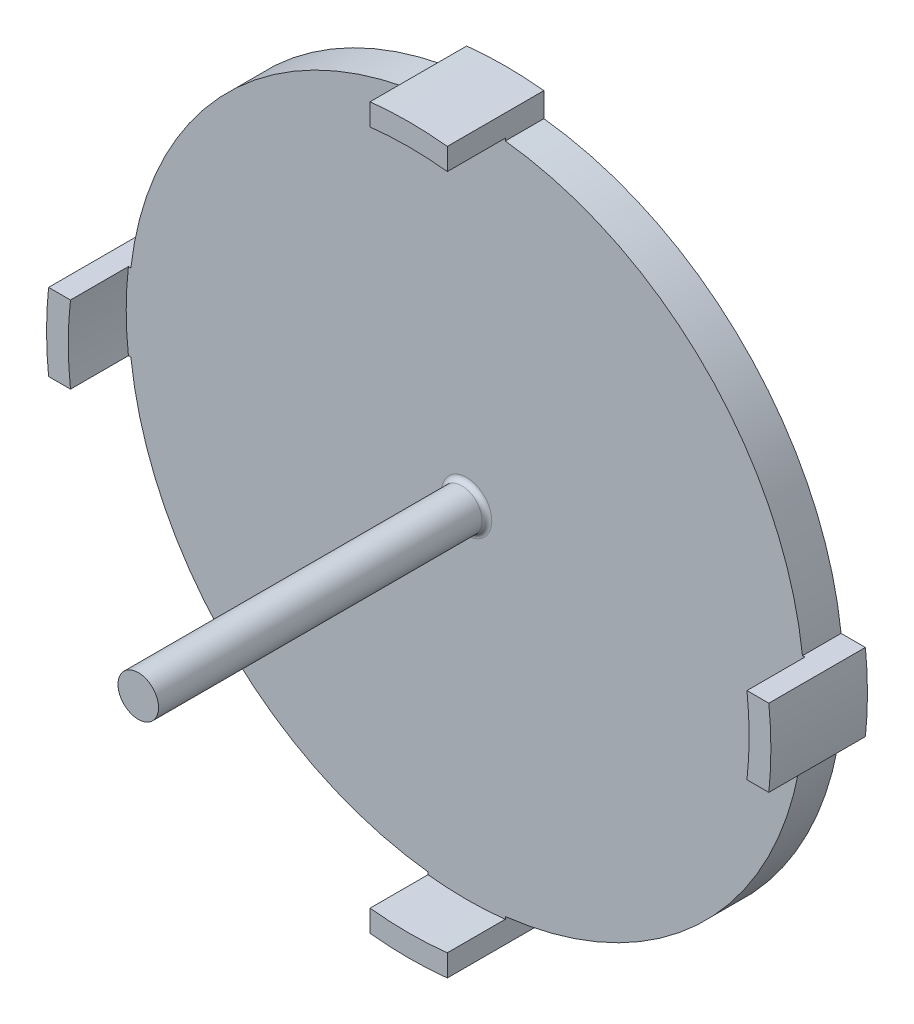
ISO-10303-21;
HEADER;
FILE_DESCRIPTION(('STEP AP214'),'2;1');
FILE_NAME('part.step','',(''),(''),'','','');
FILE_SCHEMA(('AUTOMOTIVE_DESIGN { 1 0 10303 214 1 1 1 1 }'));
ENDSEC;
DATA;
#1=APPLICATION_CONTEXT('core data for automotive mechanical design processes');
#2=APPLICATION_PROTOCOL_DEFINITION('international standard','automotive_design',2000,#1);
#3=PRODUCT_CONTEXT('',#1,'mechanical');
#4=PRODUCT('Part','Part','',(#3));
#5=PRODUCT_RELATED_PRODUCT_CATEGORY('part','',(#4));
#6=PRODUCT_DEFINITION_FORMATION('','',#4);
#7=PRODUCT_DEFINITION_CONTEXT('part definition',#1,'design');
#8=PRODUCT_DEFINITION('design','',#6,#7);
#9=PRODUCT_DEFINITION_SHAPE('','',#8);
#10=(LENGTH_UNIT() NAMED_UNIT(*) SI_UNIT(.MILLI.,.METRE.));
#11=(NAMED_UNIT(*) PLANE_ANGLE_UNIT() SI_UNIT($,.RADIAN.));
#12=(NAMED_UNIT(*) SI_UNIT($,.STERADIAN.) SOLID_ANGLE_UNIT());
#13=UNCERTAINTY_MEASURE_WITH_UNIT(LENGTH_MEASURE(1.E-05),#10,'distance_accuracy_value','');
#14=(GEOMETRIC_REPRESENTATION_CONTEXT(3) GLOBAL_UNCERTAINTY_ASSIGNED_CONTEXT((#13)) GLOBAL_UNIT_ASSIGNED_CONTEXT((#10,
#11,#12)) REPRESENTATION_CONTEXT('',''));
#15=CARTESIAN_POINT('',(0.,0.,0.));
#16=DIRECTION('',(0.,0.,1.));
#17=DIRECTION('',(1.,0.,0.));
#18=AXIS2_PLACEMENT_3D('',#15,#16,#17);
#19=CARTESIAN_POINT('',(0.,0.,10.));
#20=DIRECTION('',(0.,0.,-1.));
#21=DIRECTION('',(-1.,0.,0.));
#22=AXIS2_PLACEMENT_3D('',#19,#20,#21);
#23=CYLINDRICAL_SURFACE('',#22,35.25);
#24=CARTESIAN_POINT('',(0.,0.,4.));
#25=DIRECTION('',(0.,0.,1.));
#26=DIRECTION('',(1.,0.,0.));
#27=AXIS2_PLACEMENT_3D('',#24,#25,#26);
#28=CIRCLE('',#27,35.25);
#29=CARTESIAN_POINT('',(-35.0223143153047,4.00000000000012,4.));
#30=VERTEX_POINT('',#29);
#31=CARTESIAN_POINT('',(-35.0223143153048,-3.99999999999961,4.));
#32=VERTEX_POINT('',#31);
#33=EDGE_CURVE('E57',#30,#32,#28,.T.);
#34=ORIENTED_EDGE('',*,*,#33,.F.);
#35=DIRECTION('',(0.,0.,-1.));
#36=VECTOR('',#35,1.);
#37=CARTESIAN_POINT('',(-35.0223143153047,4.00000000000012,10.));
#38=LINE('',#37,#36);
#39=CARTESIAN_POINT('',(-35.0223143153047,4.00000000000012,10.));
#40=VERTEX_POINT('',#39);
#41=EDGE_CURVE('E85',#40,#30,#38,.T.);
#42=ORIENTED_EDGE('',*,*,#41,.F.);
#43=CARTESIAN_POINT('',(0.,0.,10.));
#44=DIRECTION('',(0.,0.,1.));
#45=DIRECTION('',(1.,0.,0.));
#46=AXIS2_PLACEMENT_3D('',#43,#44,#45);
#47=CIRCLE('',#46,35.25);
#48=CARTESIAN_POINT('',(-35.0223143153048,-3.99999999999961,10.));
#49=VERTEX_POINT('',#48);
#50=EDGE_CURVE('E373',#40,#49,#47,.T.);
#51=ORIENTED_EDGE('',*,*,#50,.T.);
#52=DIRECTION('',(0.,0.,-1.));
#53=VECTOR('',#52,1.);
#54=CARTESIAN_POINT('',(-35.0223143153048,-3.99999999999961,10.));
#55=LINE('',#54,#53);
#56=EDGE_CURVE('E381',#49,#32,#55,.T.);
#57=ORIENTED_EDGE('',*,*,#56,.T.);
#58=EDGE_LOOP('',(#34,#42,#51,#57));
#59=FACE_BOUND('',#58,.T.);
#60=ADVANCED_FACE('F41',(#59),#23,.F.);
#61=CARTESIAN_POINT('',(0.,4.,10.));
#62=DIRECTION('',(0.,-1.,0.));
#63=DIRECTION('',(1.,0.,0.));
#64=AXIS2_PLACEMENT_3D('',#61,#62,#63);
#65=PLANE('',#64);
#66=DIRECTION('',(-1.,0.,0.));
#67=VECTOR('',#66,1.);
#68=CARTESIAN_POINT('',(0.,4.,0.));
#69=LINE('',#68,#67);
#70=CARTESIAN_POINT('',(-34.7706773014274,4.00000000000012,0.));
#71=VERTEX_POINT('',#70);
#72=CARTESIAN_POINT('',(-37.2860563750043,4.00000000000013,0.));
#73=VERTEX_POINT('',#72);
#74=EDGE_CURVE('E375',#71,#73,#69,.T.);
#75=ORIENTED_EDGE('',*,*,#74,.T.);
#76=DIRECTION('',(0.,0.,-1.));
#77=VECTOR('',#76,1.);
#78=CARTESIAN_POINT('',(-37.2860563750043,4.00000000000013,10.));
#79=LINE('',#78,#77);
#80=CARTESIAN_POINT('',(-37.2860563750043,4.00000000000013,10.));
#81=VERTEX_POINT('',#80);
#82=EDGE_CURVE('E389',#81,#73,#79,.T.);
#83=ORIENTED_EDGE('',*,*,#82,.F.);
#84=DIRECTION('',(-1.,0.,0.));
#85=VECTOR('',#84,1.);
#86=CARTESIAN_POINT('',(0.,4.,10.));
#87=LINE('',#86,#85);
#88=EDGE_CURVE('E374',#40,#81,#87,.T.);
#89=ORIENTED_EDGE('',*,*,#88,.F.);
#90=ORIENTED_EDGE('',*,*,#41,.T.);
#91=DIRECTION('',(-1.,0.,0.));
#92=VECTOR('',#91,1.);
#93=CARTESIAN_POINT('',(0.,4.,4.));
#94=LINE('',#93,#92);
#95=CARTESIAN_POINT('',(-34.7706773014274,4.00000000000012,4.));
#96=VERTEX_POINT('',#95);
#97=EDGE_CURVE('E315',#96,#30,#94,.T.);
#98=ORIENTED_EDGE('',*,*,#97,.F.);
#99=DIRECTION('',(0.,0.,-1.));
#100=VECTOR('',#99,1.);
#101=CARTESIAN_POINT('',(-34.7706773014274,4.00000000000012,4.));
#102=LINE('',#101,#100);
#103=EDGE_CURVE('E365',#96,#71,#102,.T.);
#104=ORIENTED_EDGE('',*,*,#103,.T.);
#105=EDGE_LOOP('',(#75,#83,#89,#90,#98,#104));
#106=FACE_BOUND('',#105,.T.);
#107=ADVANCED_FACE('F406',(#106),#65,.F.);
#108=CARTESIAN_POINT('',(0.,0.,10.));
#109=DIRECTION('',(0.,0.,-1.));
#110=DIRECTION('',(-1.,0.,0.));
#111=AXIS2_PLACEMENT_3D('',#108,#109,#110);
#112=CYLINDRICAL_SURFACE('',#111,37.5);
#113=CARTESIAN_POINT('',(0.,0.,0.));
#114=DIRECTION('',(0.,0.,1.));
#115=DIRECTION('',(1.,0.,0.));
#116=AXIS2_PLACEMENT_3D('',#113,#114,#115);
#117=CIRCLE('',#116,37.5);
#118=CARTESIAN_POINT('',(-37.2860563750044,-3.99999999999961,0.));
#119=VERTEX_POINT('',#118);
#120=EDGE_CURVE('E81',#73,#119,#117,.T.);
#121=ORIENTED_EDGE('',*,*,#120,.T.);
#122=DIRECTION('',(0.,0.,-1.));
#123=VECTOR('',#122,1.);
#124=CARTESIAN_POINT('',(-37.2860563750044,-3.99999999999961,10.));
#125=LINE('',#124,#123);
#126=CARTESIAN_POINT('',(-37.2860563750044,-3.99999999999961,10.));
#127=VERTEX_POINT('',#126);
#128=EDGE_CURVE('E387',#127,#119,#125,.T.);
#129=ORIENTED_EDGE('',*,*,#128,.F.);
#130=CARTESIAN_POINT('',(0.,0.,10.));
#131=DIRECTION('',(0.,0.,1.));
#132=DIRECTION('',(1.,0.,0.));
#133=AXIS2_PLACEMENT_3D('',#130,#131,#132);
#134=CIRCLE('',#133,37.5);
#135=EDGE_CURVE('E378',#81,#127,#134,.T.);
#136=ORIENTED_EDGE('',*,*,#135,.F.);
#137=ORIENTED_EDGE('',*,*,#82,.T.);
#138=EDGE_LOOP('',(#121,#129,#136,#137));
#139=FACE_BOUND('',#138,.T.);
#140=ADVANCED_FACE('F412',(#139),#112,.T.);
#141=CARTESIAN_POINT('',(0.,-3.99999999999959,10.));
#142=DIRECTION('',(0.,1.,0.));
#143=DIRECTION('',(-1.,0.,0.));
#144=AXIS2_PLACEMENT_3D('',#141,#142,#143);
#145=PLANE('',#144);
#146=DIRECTION('',(1.,0.,0.));
#147=VECTOR('',#146,1.);
#148=CARTESIAN_POINT('',(0.,-3.99999999999959,0.));
#149=LINE('',#148,#147);
#150=CARTESIAN_POINT('',(-34.7706773014275,-3.99999999999961,0.));
#151=VERTEX_POINT('',#150);
#152=EDGE_CURVE('E376',#119,#151,#149,.T.);
#153=ORIENTED_EDGE('',*,*,#152,.T.);
#154=DIRECTION('',(0.,0.,-1.));
#155=VECTOR('',#154,1.);
#156=CARTESIAN_POINT('',(-34.7706773014275,-3.99999999999961,4.));
#157=LINE('',#156,#155);
#158=CARTESIAN_POINT('',(-34.7706773014275,-3.99999999999961,4.));
#159=VERTEX_POINT('',#158);
#160=EDGE_CURVE('E363',#159,#151,#157,.T.);
#161=ORIENTED_EDGE('',*,*,#160,.F.);
#162=DIRECTION('',(1.,0.,0.));
#163=VECTOR('',#162,1.);
#164=CARTESIAN_POINT('',(0.,-3.99999999999959,4.));
#165=LINE('',#164,#163);
#166=EDGE_CURVE('E316',#32,#159,#165,.T.);
#167=ORIENTED_EDGE('',*,*,#166,.F.);
#168=ORIENTED_EDGE('',*,*,#56,.F.);
#169=DIRECTION('',(1.,0.,0.));
#170=VECTOR('',#169,1.);
#171=CARTESIAN_POINT('',(0.,-3.99999999999959,10.));
#172=LINE('',#171,#170);
#173=EDGE_CURVE('E62',#127,#49,#172,.T.);
#174=ORIENTED_EDGE('',*,*,#173,.F.);
#175=ORIENTED_EDGE('',*,*,#128,.T.);
#176=EDGE_LOOP('',(#153,#161,#167,#168,#174,#175));
#177=FACE_BOUND('',#176,.T.);
#178=ADVANCED_FACE('F416',(#177),#145,.F.);
#179=CARTESIAN_POINT('',(0.,0.,10.));
#180=DIRECTION('',(0.,0.,1.));
#181=DIRECTION('',(1.,0.,0.));
#182=AXIS2_PLACEMENT_3D('',#179,#180,#181);
#183=PLANE('',#182);
#184=ORIENTED_EDGE('',*,*,#50,.F.);
#185=ORIENTED_EDGE('',*,*,#88,.T.);
#186=ORIENTED_EDGE('',*,*,#135,.T.);
#187=ORIENTED_EDGE('',*,*,#173,.T.);
#188=EDGE_LOOP('',(#184,#185,#186,#187));
#189=FACE_BOUND('',#188,.T.);
#190=ADVANCED_FACE('F423',(#189),#183,.T.);
#191=CARTESIAN_POINT('',(0.,0.,0.));
#192=DIRECTION('',(0.,0.,1.));
#193=DIRECTION('',(1.,0.,0.));
#194=AXIS2_PLACEMENT_3D('',#191,#192,#193);
#195=PLANE('',#194);
#196=ORIENTED_EDGE('',*,*,#74,.F.);
#197=CARTESIAN_POINT('',(0.,0.,0.));
#198=DIRECTION('',(0.,0.,1.));
#199=DIRECTION('',(1.,0.,0.));
#200=AXIS2_PLACEMENT_3D('',#197,#198,#199);
#201=CIRCLE('',#200,35.);
#202=CARTESIAN_POINT('',(-4.,34.7706773014274,0.));
#203=VERTEX_POINT('',#202);
#204=EDGE_CURVE('E336',#203,#71,#201,.T.);
#205=ORIENTED_EDGE('',*,*,#204,.F.);
#206=DIRECTION('',(0.,-1.,0.));
#207=VECTOR('',#206,1.);
#208=CARTESIAN_POINT('',(-4.,0.,0.));
#209=LINE('',#208,#207);
#210=CARTESIAN_POINT('',(-4.,37.2860563750043,0.));
#211=VERTEX_POINT('',#210);
#212=EDGE_CURVE('E337',#211,#203,#209,.T.);
#213=ORIENTED_EDGE('',*,*,#212,.F.);
#214=CARTESIAN_POINT('',(0.,0.,0.));
#215=DIRECTION('',(0.,0.,1.));
#216=DIRECTION('',(1.,0.,0.));
#217=AXIS2_PLACEMENT_3D('',#214,#215,#216);
#218=CIRCLE('',#217,37.5);
#219=CARTESIAN_POINT('',(4.,37.2860563750043,0.));
#220=VERTEX_POINT('',#219);
#221=EDGE_CURVE('E273',#220,#211,#218,.T.);
#222=ORIENTED_EDGE('',*,*,#221,.F.);
#223=DIRECTION('',(0.,-1.,0.));
#224=VECTOR('',#223,1.);
#225=CARTESIAN_POINT('',(4.,0.,0.));
#226=LINE('',#225,#224);
#227=CARTESIAN_POINT('',(4.,34.7706773014274,0.));
#228=VERTEX_POINT('',#227);
#229=EDGE_CURVE('E333',#220,#228,#226,.T.);
#230=ORIENTED_EDGE('',*,*,#229,.T.);
#231=CARTESIAN_POINT('',(34.7706773014274,3.99999999999988,0.));
#232=VERTEX_POINT('',#231);
#233=EDGE_CURVE('E300',#232,#228,#201,.T.);
#234=ORIENTED_EDGE('',*,*,#233,.F.);
#235=DIRECTION('',(-1.,0.,0.));
#236=VECTOR('',#235,1.);
#237=CARTESIAN_POINT('',(0.,4.,0.));
#238=LINE('',#237,#236);
#239=CARTESIAN_POINT('',(37.2860563750043,3.99999999999987,0.));
#240=VERTEX_POINT('',#239);
#241=EDGE_CURVE('E302',#240,#232,#238,.T.);
#242=ORIENTED_EDGE('',*,*,#241,.F.);
#243=CARTESIAN_POINT('',(0.,0.,0.));
#244=DIRECTION('',(0.,0.,1.));
#245=DIRECTION('',(1.,0.,0.));
#246=AXIS2_PLACEMENT_3D('',#243,#244,#245);
#247=CIRCLE('',#246,37.5);
#248=CARTESIAN_POINT('',(37.2860563750044,-3.99999999999958,0.));
#249=VERTEX_POINT('',#248);
#250=EDGE_CURVE('E225',#249,#240,#247,.T.);
#251=ORIENTED_EDGE('',*,*,#250,.F.);
#252=DIRECTION('',(1.,0.,0.));
#253=VECTOR('',#252,1.);
#254=CARTESIAN_POINT('',(0.,-3.99999999999983,0.));
#255=LINE('',#254,#253);
#256=CARTESIAN_POINT('',(34.7706773014275,-3.99999999999959,0.));
#257=VERTEX_POINT('',#256);
#258=EDGE_CURVE('E350',#257,#249,#255,.T.);
#259=ORIENTED_EDGE('',*,*,#258,.F.);
#260=CARTESIAN_POINT('',(4.,-34.7706773014274,0.));
#261=VERTEX_POINT('',#260);
#262=EDGE_CURVE('E339',#261,#257,#201,.T.);
#263=ORIENTED_EDGE('',*,*,#262,.F.);
#264=DIRECTION('',(0.,1.,0.));
#265=VECTOR('',#264,1.);
#266=CARTESIAN_POINT('',(3.99999999999998,0.,0.));
#267=LINE('',#266,#265);
#268=CARTESIAN_POINT('',(4.,-37.2860563750043,0.));
#269=VERTEX_POINT('',#268);
#270=EDGE_CURVE('E343',#269,#261,#267,.T.);
#271=ORIENTED_EDGE('',*,*,#270,.F.);
#272=CARTESIAN_POINT('',(0.,0.,0.));
#273=DIRECTION('',(0.,0.,1.));
#274=DIRECTION('',(1.,0.,0.));
#275=AXIS2_PLACEMENT_3D('',#272,#273,#274);
#276=CIRCLE('',#275,37.5);
#277=CARTESIAN_POINT('',(-4.,-37.2860563750043,0.));
#278=VERTEX_POINT('',#277);
#279=EDGE_CURVE('E240',#278,#269,#276,.T.);
#280=ORIENTED_EDGE('',*,*,#279,.F.);
#281=DIRECTION('',(0.,-1.,0.));
#282=VECTOR('',#281,1.);
#283=CARTESIAN_POINT('',(-4.,0.,0.));
#284=LINE('',#283,#282);
#285=CARTESIAN_POINT('',(-4.,-34.7706773014274,0.));
#286=VERTEX_POINT('',#285);
#287=EDGE_CURVE('E342',#286,#278,#284,.T.);
#288=ORIENTED_EDGE('',*,*,#287,.F.);
#289=EDGE_CURVE('E345',#151,#286,#201,.T.);
#290=ORIENTED_EDGE('',*,*,#289,.F.);
#291=ORIENTED_EDGE('',*,*,#152,.F.);
#292=ORIENTED_EDGE('',*,*,#120,.F.);
#293=EDGE_LOOP('',(#196,#205,#213,#222,#230,#234,#242,#251,#259,#263,#271,#280,#288,#290,#291,#292));
#294=FACE_BOUND('',#293,.T.);
#295=ADVANCED_FACE('F421',(#294),#195,.F.);
#296=CARTESIAN_POINT('',(0.,0.,4.));
#297=DIRECTION('',(0.,0.,-1.));
#298=DIRECTION('',(-1.,0.,0.));
#299=AXIS2_PLACEMENT_3D('',#296,#297,#298);
#300=CYLINDRICAL_SURFACE('',#299,35.);
#301=ORIENTED_EDGE('',*,*,#233,.T.);
#302=DIRECTION('',(0.,0.,-1.));
#303=VECTOR('',#302,1.);
#304=CARTESIAN_POINT('',(4.,34.7706773014274,4.));
#305=LINE('',#304,#303);
#306=CARTESIAN_POINT('',(4.,34.7706773014274,4.));
#307=VERTEX_POINT('',#306);
#308=EDGE_CURVE('E367',#307,#228,#305,.T.);
#309=ORIENTED_EDGE('',*,*,#308,.F.);
#310=CARTESIAN_POINT('',(0.,0.,4.));
#311=DIRECTION('',(0.,0.,1.));
#312=DIRECTION('',(1.,0.,0.));
#313=AXIS2_PLACEMENT_3D('',#310,#311,#312);
#314=CIRCLE('',#313,35.);
#315=CARTESIAN_POINT('',(34.7706773014274,3.99999999999988,4.));
#316=VERTEX_POINT('',#315);
#317=EDGE_CURVE('E298',#316,#307,#314,.T.);
#318=ORIENTED_EDGE('',*,*,#317,.F.);
#319=DIRECTION('',(0.,0.,-1.));
#320=VECTOR('',#319,1.);
#321=CARTESIAN_POINT('',(34.7706773014274,3.99999999999988,4.));
#322=LINE('',#321,#320);
#323=EDGE_CURVE('E335',#316,#232,#322,.T.);
#324=ORIENTED_EDGE('',*,*,#323,.T.);
#325=EDGE_LOOP('',(#301,#309,#318,#324));
#326=FACE_BOUND('',#325,.T.);
#327=ADVANCED_FACE('F426',(#326),#300,.T.);
#328=CARTESIAN_POINT('',(4.,0.,4.));
#329=DIRECTION('',(1.,0.,0.));
#330=DIRECTION('',(0.,0.,-1.));
#331=AXIS2_PLACEMENT_3D('',#328,#329,#330);
#332=PLANE('',#331);
#333=ORIENTED_EDGE('',*,*,#229,.F.);
#334=DIRECTION('',(0.,0.,-1.));
#335=VECTOR('',#334,1.);
#336=CARTESIAN_POINT('',(4.,37.2860563750043,10.));
#337=LINE('',#336,#335);
#338=CARTESIAN_POINT('',(4.,37.2860563750043,10.));
#339=VERTEX_POINT('',#338);
#340=EDGE_CURVE('E293',#339,#220,#337,.T.);
#341=ORIENTED_EDGE('',*,*,#340,.F.);
#342=DIRECTION('',(0.,-1.,0.));
#343=VECTOR('',#342,1.);
#344=CARTESIAN_POINT('',(4.,0.,10.));
#345=LINE('',#344,#343);
#346=CARTESIAN_POINT('',(4.,35.0223143153048,10.));
#347=VERTEX_POINT('',#346);
#348=EDGE_CURVE('E274',#339,#347,#345,.T.);
#349=ORIENTED_EDGE('',*,*,#348,.T.);
#350=DIRECTION('',(0.,0.,-1.));
#351=VECTOR('',#350,1.);
#352=CARTESIAN_POINT('',(4.,35.0223143153048,10.));
#353=LINE('',#352,#351);
#354=CARTESIAN_POINT('',(4.,35.0223143153048,4.));
#355=VERTEX_POINT('',#354);
#356=EDGE_CURVE('E282',#347,#355,#353,.T.);
#357=ORIENTED_EDGE('',*,*,#356,.T.);
#358=DIRECTION('',(0.,-1.,0.));
#359=VECTOR('',#358,1.);
#360=CARTESIAN_POINT('',(4.,0.,4.));
#361=LINE('',#360,#359);
#362=EDGE_CURVE('E301',#355,#307,#361,.T.);
#363=ORIENTED_EDGE('',*,*,#362,.T.);
#364=ORIENTED_EDGE('',*,*,#308,.T.);
#365=EDGE_LOOP('',(#333,#341,#349,#357,#363,#364));
#366=FACE_BOUND('',#365,.T.);
#367=ADVANCED_FACE('F427',(#366),#332,.T.);
#368=CARTESIAN_POINT('',(-4.,0.,4.));
#369=DIRECTION('',(1.,0.,0.));
#370=DIRECTION('',(0.,0.,-1.));
#371=AXIS2_PLACEMENT_3D('',#368,#369,#370);
#372=PLANE('',#371);
#373=ORIENTED_EDGE('',*,*,#212,.T.);
#374=DIRECTION('',(0.,0.,-1.));
#375=VECTOR('',#374,1.);
#376=CARTESIAN_POINT('',(-4.,34.7706773014274,4.));
#377=LINE('',#376,#375);
#378=CARTESIAN_POINT('',(-4.,34.7706773014274,4.));
#379=VERTEX_POINT('',#378);
#380=EDGE_CURVE('E370',#379,#203,#377,.T.);
#381=ORIENTED_EDGE('',*,*,#380,.F.);
#382=DIRECTION('',(0.,-1.,0.));
#383=VECTOR('',#382,1.);
#384=CARTESIAN_POINT('',(-4.,0.,4.));
#385=LINE('',#384,#383);
#386=CARTESIAN_POINT('',(-4.,35.0223143153048,4.));
#387=VERTEX_POINT('',#386);
#388=EDGE_CURVE('E309',#387,#379,#385,.T.);
#389=ORIENTED_EDGE('',*,*,#388,.F.);
#390=DIRECTION('',(0.,0.,-1.));
#391=VECTOR('',#390,1.);
#392=CARTESIAN_POINT('',(-4.,35.0223143153048,10.));
#393=LINE('',#392,#391);
#394=CARTESIAN_POINT('',(-4.,35.0223143153048,10.));
#395=VERTEX_POINT('',#394);
#396=EDGE_CURVE('E290',#395,#387,#393,.T.);
#397=ORIENTED_EDGE('',*,*,#396,.F.);
#398=DIRECTION('',(0.,-1.,0.));
#399=VECTOR('',#398,1.);
#400=CARTESIAN_POINT('',(-4.,0.,10.));
#401=LINE('',#400,#399);
#402=CARTESIAN_POINT('',(-4.,37.2860563750043,10.));
#403=VERTEX_POINT('',#402);
#404=EDGE_CURVE('E278',#403,#395,#401,.T.);
#405=ORIENTED_EDGE('',*,*,#404,.F.);
#406=DIRECTION('',(0.,0.,-1.));
#407=VECTOR('',#406,1.);
#408=CARTESIAN_POINT('',(-4.,37.2860563750043,10.));
#409=LINE('',#408,#407);
#410=EDGE_CURVE('E295',#403,#211,#409,.T.);
#411=ORIENTED_EDGE('',*,*,#410,.T.);
#412=EDGE_LOOP('',(#373,#381,#389,#397,#405,#411));
#413=FACE_BOUND('',#412,.T.);
#414=ADVANCED_FACE('F435',(#413),#372,.F.);
#415=ORIENTED_EDGE('',*,*,#204,.T.);
#416=ORIENTED_EDGE('',*,*,#103,.F.);
#417=EDGE_CURVE('E303',#379,#96,#314,.T.);
#418=ORIENTED_EDGE('',*,*,#417,.F.);
#419=ORIENTED_EDGE('',*,*,#380,.T.);
#420=EDGE_LOOP('',(#415,#416,#418,#419));
#421=FACE_BOUND('',#420,.T.);
#422=ADVANCED_FACE('F436',(#421),#300,.T.);
#423=ORIENTED_EDGE('',*,*,#289,.T.);
#424=DIRECTION('',(0.,0.,-1.));
#425=VECTOR('',#424,1.);
#426=CARTESIAN_POINT('',(-4.,-34.7706773014274,4.));
#427=LINE('',#426,#425);
#428=CARTESIAN_POINT('',(-4.,-34.7706773014274,4.));
#429=VERTEX_POINT('',#428);
#430=EDGE_CURVE('E359',#429,#286,#427,.T.);
#431=ORIENTED_EDGE('',*,*,#430,.F.);
#432=EDGE_CURVE('E318',#159,#429,#314,.T.);
#433=ORIENTED_EDGE('',*,*,#432,.F.);
#434=ORIENTED_EDGE('',*,*,#160,.T.);
#435=EDGE_LOOP('',(#423,#431,#433,#434));
#436=FACE_BOUND('',#435,.T.);
#437=ADVANCED_FACE('F442',(#436),#300,.T.);
#438=CARTESIAN_POINT('',(-4.,0.,4.));
#439=DIRECTION('',(1.,0.,0.));
#440=DIRECTION('',(0.,0.,-1.));
#441=AXIS2_PLACEMENT_3D('',#438,#439,#440);
#442=PLANE('',#441);
#443=ORIENTED_EDGE('',*,*,#287,.T.);
#444=DIRECTION('',(0.,0.,-1.));
#445=VECTOR('',#444,1.);
#446=CARTESIAN_POINT('',(-4.,-37.2860563750043,10.));
#447=LINE('',#446,#445);
#448=CARTESIAN_POINT('',(-4.,-37.2860563750043,10.));
#449=VERTEX_POINT('',#448);
#450=EDGE_CURVE('E224',#449,#278,#447,.T.);
#451=ORIENTED_EDGE('',*,*,#450,.F.);
#452=DIRECTION('',(0.,-1.,0.));
#453=VECTOR('',#452,1.);
#454=CARTESIAN_POINT('',(-4.,0.,10.));
#455=LINE('',#454,#453);
#456=CARTESIAN_POINT('',(-4.,-35.0223143153048,10.));
#457=VERTEX_POINT('',#456);
#458=EDGE_CURVE('E229',#457,#449,#455,.T.);
#459=ORIENTED_EDGE('',*,*,#458,.F.);
#460=DIRECTION('',(0.,0.,-1.));
#461=VECTOR('',#460,1.);
#462=CARTESIAN_POINT('',(-4.,-35.0223143153048,10.));
#463=LINE('',#462,#461);
#464=CARTESIAN_POINT('',(-4.,-35.0223143153048,4.));
#465=VERTEX_POINT('',#464);
#466=EDGE_CURVE('E215',#457,#465,#463,.T.);
#467=ORIENTED_EDGE('',*,*,#466,.T.);
#468=DIRECTION('',(0.,-1.,0.));
#469=VECTOR('',#468,1.);
#470=CARTESIAN_POINT('',(-4.,0.,4.));
#471=LINE('',#470,#469);
#472=EDGE_CURVE('E317',#429,#465,#471,.T.);
#473=ORIENTED_EDGE('',*,*,#472,.F.);
#474=ORIENTED_EDGE('',*,*,#430,.T.);
#475=EDGE_LOOP('',(#443,#451,#459,#467,#473,#474));
#476=FACE_BOUND('',#475,.T.);
#477=ADVANCED_FACE('F226',(#476),#442,.F.);
#478=CARTESIAN_POINT('',(3.99999999999998,0.,4.));
#479=DIRECTION('',(-1.,0.,0.));
#480=DIRECTION('',(0.,-1.,0.));
#481=AXIS2_PLACEMENT_3D('',#478,#479,#480);
#482=PLANE('',#481);
#483=ORIENTED_EDGE('',*,*,#270,.T.);
#484=DIRECTION('',(0.,0.,-1.));
#485=VECTOR('',#484,1.);
#486=CARTESIAN_POINT('',(4.,-34.7706773014274,4.));
#487=LINE('',#486,#485);
#488=CARTESIAN_POINT('',(4.,-34.7706773014274,4.));
#489=VERTEX_POINT('',#488);
#490=EDGE_CURVE('E352',#489,#261,#487,.T.);
#491=ORIENTED_EDGE('',*,*,#490,.F.);
#492=DIRECTION('',(0.,1.,0.));
#493=VECTOR('',#492,1.);
#494=CARTESIAN_POINT('',(3.99999999999998,0.,4.));
#495=LINE('',#494,#493);
#496=CARTESIAN_POINT('',(4.,-35.0223143153048,4.));
#497=VERTEX_POINT('',#496);
#498=EDGE_CURVE('E325',#497,#489,#495,.T.);
#499=ORIENTED_EDGE('',*,*,#498,.F.);
#500=DIRECTION('',(0.,0.,-1.));
#501=VECTOR('',#500,1.);
#502=CARTESIAN_POINT('',(4.,-35.0223143153048,10.));
#503=LINE('',#502,#501);
#504=CARTESIAN_POINT('',(4.,-35.0223143153048,10.));
#505=VERTEX_POINT('',#504);
#506=EDGE_CURVE('E242',#505,#497,#503,.T.);
#507=ORIENTED_EDGE('',*,*,#506,.F.);
#508=DIRECTION('',(0.,1.,0.));
#509=VECTOR('',#508,1.);
#510=CARTESIAN_POINT('',(3.99999999999998,0.,10.));
#511=LINE('',#510,#509);
#512=CARTESIAN_POINT('',(4.,-37.2860563750043,10.));
#513=VERTEX_POINT('',#512);
#514=EDGE_CURVE('E235',#513,#505,#511,.T.);
#515=ORIENTED_EDGE('',*,*,#514,.F.);
#516=DIRECTION('',(0.,0.,-1.));
#517=VECTOR('',#516,1.);
#518=CARTESIAN_POINT('',(4.,-37.2860563750043,10.));
#519=LINE('',#518,#517);
#520=EDGE_CURVE('E249',#513,#269,#519,.T.);
#521=ORIENTED_EDGE('',*,*,#520,.T.);
#522=EDGE_LOOP('',(#483,#491,#499,#507,#515,#521));
#523=FACE_BOUND('',#522,.T.);
#524=ADVANCED_FACE('F439',(#523),#482,.F.);
#525=ORIENTED_EDGE('',*,*,#262,.T.);
#526=DIRECTION('',(0.,0.,-1.));
#527=VECTOR('',#526,1.);
#528=CARTESIAN_POINT('',(34.7706773014275,-3.99999999999959,4.));
#529=LINE('',#528,#527);
#530=CARTESIAN_POINT('',(34.7706773014275,-3.99999999999959,4.));
#531=VERTEX_POINT('',#530);
#532=EDGE_CURVE('E351',#531,#257,#529,.T.);
#533=ORIENTED_EDGE('',*,*,#532,.F.);
#534=EDGE_CURVE('E304',#489,#531,#314,.T.);
#535=ORIENTED_EDGE('',*,*,#534,.F.);
#536=ORIENTED_EDGE('',*,*,#490,.T.);
#537=EDGE_LOOP('',(#525,#533,#535,#536));
#538=FACE_BOUND('',#537,.T.);
#539=ADVANCED_FACE('F441',(#538),#300,.T.);
#540=CARTESIAN_POINT('',(0.,-3.99999999999983,4.));
#541=DIRECTION('',(0.,1.,0.));
#542=DIRECTION('',(-1.,0.,0.));
#543=AXIS2_PLACEMENT_3D('',#540,#541,#542);
#544=PLANE('',#543);
#545=ORIENTED_EDGE('',*,*,#258,.T.);
#546=DIRECTION('',(0.,0.,-1.));
#547=VECTOR('',#546,1.);
#548=CARTESIAN_POINT('',(37.2860563750044,-3.99999999999958,10.));
#549=LINE('',#548,#547);
#550=CARTESIAN_POINT('',(37.2860563750044,-3.99999999999958,10.));
#551=VERTEX_POINT('',#550);
#552=EDGE_CURVE('E268',#551,#249,#549,.T.);
#553=ORIENTED_EDGE('',*,*,#552,.F.);
#554=DIRECTION('',(1.,0.,0.));
#555=VECTOR('',#554,1.);
#556=CARTESIAN_POINT('',(0.,-3.99999999999983,10.));
#557=LINE('',#556,#555);
#558=CARTESIAN_POINT('',(35.0223143153048,-3.99999999999959,10.));
#559=VERTEX_POINT('',#558);
#560=EDGE_CURVE('E254',#559,#551,#557,.T.);
#561=ORIENTED_EDGE('',*,*,#560,.F.);
#562=DIRECTION('',(0.,0.,-1.));
#563=VECTOR('',#562,1.);
#564=CARTESIAN_POINT('',(35.0223143153048,-3.99999999999959,10.));
#565=LINE('',#564,#563);
#566=CARTESIAN_POINT('',(35.0223143153048,-3.99999999999959,4.));
#567=VERTEX_POINT('',#566);
#568=EDGE_CURVE('E271',#559,#567,#565,.T.);
#569=ORIENTED_EDGE('',*,*,#568,.T.);
#570=DIRECTION('',(1.,0.,0.));
#571=VECTOR('',#570,1.);
#572=CARTESIAN_POINT('',(0.,-3.99999999999983,4.));
#573=LINE('',#572,#571);
#574=EDGE_CURVE('E322',#531,#567,#573,.T.);
#575=ORIENTED_EDGE('',*,*,#574,.F.);
#576=ORIENTED_EDGE('',*,*,#532,.T.);
#577=EDGE_LOOP('',(#545,#553,#561,#569,#575,#576));
#578=FACE_BOUND('',#577,.T.);
#579=ADVANCED_FACE('F450',(#578),#544,.F.);
#580=CARTESIAN_POINT('',(0.,4.,4.));
#581=DIRECTION('',(0.,-1.,0.));
#582=DIRECTION('',(1.,0.,0.));
#583=AXIS2_PLACEMENT_3D('',#580,#581,#582);
#584=PLANE('',#583);
#585=ORIENTED_EDGE('',*,*,#241,.T.);
#586=ORIENTED_EDGE('',*,*,#323,.F.);
#587=DIRECTION('',(-1.,0.,0.));
#588=VECTOR('',#587,1.);
#589=CARTESIAN_POINT('',(0.,4.,4.));
#590=LINE('',#589,#588);
#591=CARTESIAN_POINT('',(35.0223143153048,3.99999999999988,4.));
#592=VERTEX_POINT('',#591);
#593=EDGE_CURVE('E329',#592,#316,#590,.T.);
#594=ORIENTED_EDGE('',*,*,#593,.F.);
#595=DIRECTION('',(0.,0.,-1.));
#596=VECTOR('',#595,1.);
#597=CARTESIAN_POINT('',(35.0223143153048,3.99999999999988,10.));
#598=LINE('',#597,#596);
#599=CARTESIAN_POINT('',(35.0223143153048,3.99999999999988,10.));
#600=VERTEX_POINT('',#599);
#601=EDGE_CURVE('E261',#600,#592,#598,.T.);
#602=ORIENTED_EDGE('',*,*,#601,.F.);
#603=DIRECTION('',(-1.,0.,0.));
#604=VECTOR('',#603,1.);
#605=CARTESIAN_POINT('',(0.,4.,10.));
#606=LINE('',#605,#604);
#607=CARTESIAN_POINT('',(37.2860563750043,3.99999999999987,10.));
#608=VERTEX_POINT('',#607);
#609=EDGE_CURVE('E259',#608,#600,#606,.T.);
#610=ORIENTED_EDGE('',*,*,#609,.F.);
#611=DIRECTION('',(0.,0.,-1.));
#612=VECTOR('',#611,1.);
#613=CARTESIAN_POINT('',(37.2860563750043,3.99999999999987,10.));
#614=LINE('',#613,#612);
#615=EDGE_CURVE('E264',#608,#240,#614,.T.);
#616=ORIENTED_EDGE('',*,*,#615,.T.);
#617=EDGE_LOOP('',(#585,#586,#594,#602,#610,#616));
#618=FACE_BOUND('',#617,.T.);
#619=ADVANCED_FACE('F452',(#618),#584,.F.);
#620=CARTESIAN_POINT('',(0.,0.,4.));
#621=DIRECTION('',(0.,0.,1.));
#622=DIRECTION('',(1.,0.,0.));
#623=AXIS2_PLACEMENT_3D('',#620,#621,#622);
#624=PLANE('',#623);
#625=CARTESIAN_POINT('',(0.,0.,4.));
#626=DIRECTION('',(0.,0.,1.));
#627=DIRECTION('',(1.,0.,0.));
#628=AXIS2_PLACEMENT_3D('',#625,#626,#627);
#629=CIRCLE('',#628,2.6);
#630=CARTESIAN_POINT('',(2.6,0.,4.));
#631=VERTEX_POINT('',#630);
#632=EDGE_CURVE('E11',#631,#631,#629,.F.);
#633=ORIENTED_EDGE('',*,*,#632,.T.);
#634=EDGE_LOOP('',(#633));
#635=FACE_BOUND('',#634,.T.);
#636=ORIENTED_EDGE('',*,*,#317,.T.);
#637=ORIENTED_EDGE('',*,*,#362,.F.);
#638=CARTESIAN_POINT('',(0.,0.,4.));
#639=DIRECTION('',(0.,0.,1.));
#640=DIRECTION('',(1.,0.,0.));
#641=AXIS2_PLACEMENT_3D('',#638,#639,#640);
#642=CIRCLE('',#641,35.25);
#643=EDGE_CURVE('E307',#355,#387,#642,.T.);
#644=ORIENTED_EDGE('',*,*,#643,.T.);
#645=ORIENTED_EDGE('',*,*,#388,.T.);
#646=ORIENTED_EDGE('',*,*,#417,.T.);
#647=ORIENTED_EDGE('',*,*,#97,.T.);
#648=ORIENTED_EDGE('',*,*,#33,.T.);
#649=ORIENTED_EDGE('',*,*,#166,.T.);
#650=ORIENTED_EDGE('',*,*,#432,.T.);
#651=ORIENTED_EDGE('',*,*,#472,.T.);
#652=CARTESIAN_POINT('',(0.,0.,4.));
#653=DIRECTION('',(0.,0.,1.));
#654=DIRECTION('',(1.,0.,0.));
#655=AXIS2_PLACEMENT_3D('',#652,#653,#654);
#656=CIRCLE('',#655,35.25);
#657=EDGE_CURVE('E217',#465,#497,#656,.T.);
#658=ORIENTED_EDGE('',*,*,#657,.T.);
#659=ORIENTED_EDGE('',*,*,#498,.T.);
#660=ORIENTED_EDGE('',*,*,#534,.T.);
#661=ORIENTED_EDGE('',*,*,#574,.T.);
#662=CARTESIAN_POINT('',(0.,0.,4.));
#663=DIRECTION('',(0.,0.,1.));
#664=DIRECTION('',(1.,0.,0.));
#665=AXIS2_PLACEMENT_3D('',#662,#663,#664);
#666=CIRCLE('',#665,35.25);
#667=EDGE_CURVE('E330',#567,#592,#666,.T.);
#668=ORIENTED_EDGE('',*,*,#667,.T.);
#669=ORIENTED_EDGE('',*,*,#593,.T.);
#670=EDGE_LOOP('',(#636,#637,#644,#645,#646,#647,#648,#649,#650,#651,#658,#659,#660,#661,#668,#669));
#671=FACE_BOUND('',#670,.T.);
#672=ADVANCED_FACE('F457',(#635,#671),#624,.T.);
#673=CARTESIAN_POINT('',(0.,0.,10.));
#674=DIRECTION('',(0.,0.,-1.));
#675=DIRECTION('',(-1.,0.,0.));
#676=AXIS2_PLACEMENT_3D('',#673,#674,#675);
#677=CYLINDRICAL_SURFACE('',#676,35.25);
#678=ORIENTED_EDGE('',*,*,#643,.F.);
#679=ORIENTED_EDGE('',*,*,#356,.F.);
#680=CARTESIAN_POINT('',(0.,0.,10.));
#681=DIRECTION('',(0.,0.,1.));
#682=DIRECTION('',(1.,0.,0.));
#683=AXIS2_PLACEMENT_3D('',#680,#681,#682);
#684=CIRCLE('',#683,35.25);
#685=EDGE_CURVE('E281',#347,#395,#684,.T.);
#686=ORIENTED_EDGE('',*,*,#685,.T.);
#687=ORIENTED_EDGE('',*,*,#396,.T.);
#688=EDGE_LOOP('',(#678,#679,#686,#687));
#689=FACE_BOUND('',#688,.T.);
#690=ADVANCED_FACE('F458',(#689),#677,.F.);
#691=CARTESIAN_POINT('',(0.,0.,10.));
#692=DIRECTION('',(0.,0.,-1.));
#693=DIRECTION('',(-1.,0.,0.));
#694=AXIS2_PLACEMENT_3D('',#691,#692,#693);
#695=CYLINDRICAL_SURFACE('',#694,37.5);
#696=ORIENTED_EDGE('',*,*,#221,.T.);
#697=ORIENTED_EDGE('',*,*,#410,.F.);
#698=CARTESIAN_POINT('',(0.,0.,10.));
#699=DIRECTION('',(0.,0.,1.));
#700=DIRECTION('',(1.,0.,0.));
#701=AXIS2_PLACEMENT_3D('',#698,#699,#700);
#702=CIRCLE('',#701,37.5);
#703=EDGE_CURVE('E279',#339,#403,#702,.T.);
#704=ORIENTED_EDGE('',*,*,#703,.F.);
#705=ORIENTED_EDGE('',*,*,#340,.T.);
#706=EDGE_LOOP('',(#696,#697,#704,#705));
#707=FACE_BOUND('',#706,.T.);
#708=ADVANCED_FACE('F461',(#707),#695,.T.);
#709=CARTESIAN_POINT('',(0.,0.,10.));
#710=DIRECTION('',(0.,0.,1.));
#711=DIRECTION('',(1.,0.,0.));
#712=AXIS2_PLACEMENT_3D('',#709,#710,#711);
#713=PLANE('',#712);
#714=ORIENTED_EDGE('',*,*,#348,.F.);
#715=ORIENTED_EDGE('',*,*,#703,.T.);
#716=ORIENTED_EDGE('',*,*,#404,.T.);
#717=ORIENTED_EDGE('',*,*,#685,.F.);
#718=EDGE_LOOP('',(#714,#715,#716,#717));
#719=FACE_BOUND('',#718,.T.);
#720=ADVANCED_FACE('F462',(#719),#713,.T.);
#721=CARTESIAN_POINT('',(0.,0.,10.));
#722=DIRECTION('',(0.,0.,-1.));
#723=DIRECTION('',(-1.,0.,0.));
#724=AXIS2_PLACEMENT_3D('',#721,#722,#723);
#725=CYLINDRICAL_SURFACE('',#724,35.25);
#726=ORIENTED_EDGE('',*,*,#667,.F.);
#727=ORIENTED_EDGE('',*,*,#568,.F.);
#728=CARTESIAN_POINT('',(0.,0.,10.));
#729=DIRECTION('',(0.,0.,1.));
#730=DIRECTION('',(1.,0.,0.));
#731=AXIS2_PLACEMENT_3D('',#728,#729,#730);
#732=CIRCLE('',#731,35.25);
#733=EDGE_CURVE('E252',#559,#600,#732,.T.);
#734=ORIENTED_EDGE('',*,*,#733,.T.);
#735=ORIENTED_EDGE('',*,*,#601,.T.);
#736=EDGE_LOOP('',(#726,#727,#734,#735));
#737=FACE_BOUND('',#736,.T.);
#738=ADVANCED_FACE('F472',(#737),#725,.F.);
#739=CARTESIAN_POINT('',(0.,0.,10.));
#740=DIRECTION('',(0.,0.,-1.));
#741=DIRECTION('',(-1.,0.,0.));
#742=AXIS2_PLACEMENT_3D('',#739,#740,#741);
#743=CYLINDRICAL_SURFACE('',#742,37.5);
#744=ORIENTED_EDGE('',*,*,#250,.T.);
#745=ORIENTED_EDGE('',*,*,#615,.F.);
#746=CARTESIAN_POINT('',(0.,0.,10.));
#747=DIRECTION('',(0.,0.,1.));
#748=DIRECTION('',(1.,0.,0.));
#749=AXIS2_PLACEMENT_3D('',#746,#747,#748);
#750=CIRCLE('',#749,37.5);
#751=EDGE_CURVE('E260',#551,#608,#750,.T.);
#752=ORIENTED_EDGE('',*,*,#751,.F.);
#753=ORIENTED_EDGE('',*,*,#552,.T.);
#754=EDGE_LOOP('',(#744,#745,#752,#753));
#755=FACE_BOUND('',#754,.T.);
#756=ADVANCED_FACE('F478',(#755),#743,.T.);
#757=CARTESIAN_POINT('',(0.,0.,10.));
#758=DIRECTION('',(0.,0.,1.));
#759=DIRECTION('',(1.,0.,0.));
#760=AXIS2_PLACEMENT_3D('',#757,#758,#759);
#761=PLANE('',#760);
#762=ORIENTED_EDGE('',*,*,#733,.F.);
#763=ORIENTED_EDGE('',*,*,#560,.T.);
#764=ORIENTED_EDGE('',*,*,#751,.T.);
#765=ORIENTED_EDGE('',*,*,#609,.T.);
#766=EDGE_LOOP('',(#762,#763,#764,#765));
#767=FACE_BOUND('',#766,.T.);
#768=ADVANCED_FACE('F477',(#767),#761,.T.);
#769=CARTESIAN_POINT('',(0.,0.,10.));
#770=DIRECTION('',(0.,0.,-1.));
#771=DIRECTION('',(-1.,0.,0.));
#772=AXIS2_PLACEMENT_3D('',#769,#770,#771);
#773=CYLINDRICAL_SURFACE('',#772,35.25);
#774=ORIENTED_EDGE('',*,*,#657,.F.);
#775=ORIENTED_EDGE('',*,*,#466,.F.);
#776=CARTESIAN_POINT('',(0.,0.,10.));
#777=DIRECTION('',(0.,0.,1.));
#778=DIRECTION('',(1.,0.,0.));
#779=AXIS2_PLACEMENT_3D('',#776,#777,#778);
#780=CIRCLE('',#779,35.25);
#781=EDGE_CURVE('E216',#457,#505,#780,.T.);
#782=ORIENTED_EDGE('',*,*,#781,.T.);
#783=ORIENTED_EDGE('',*,*,#506,.T.);
#784=EDGE_LOOP('',(#774,#775,#782,#783));
#785=FACE_BOUND('',#784,.T.);
#786=ADVANCED_FACE('F212',(#785),#773,.F.);
#787=CARTESIAN_POINT('',(0.,0.,10.));
#788=DIRECTION('',(0.,0.,-1.));
#789=DIRECTION('',(-1.,0.,0.));
#790=AXIS2_PLACEMENT_3D('',#787,#788,#789);
#791=CYLINDRICAL_SURFACE('',#790,37.5);
#792=ORIENTED_EDGE('',*,*,#279,.T.);
#793=ORIENTED_EDGE('',*,*,#520,.F.);
#794=CARTESIAN_POINT('',(0.,0.,10.));
#795=DIRECTION('',(0.,0.,1.));
#796=DIRECTION('',(1.,0.,0.));
#797=AXIS2_PLACEMENT_3D('',#794,#795,#796);
#798=CIRCLE('',#797,37.5);
#799=EDGE_CURVE('E231',#449,#513,#798,.T.);
#800=ORIENTED_EDGE('',*,*,#799,.F.);
#801=ORIENTED_EDGE('',*,*,#450,.T.);
#802=EDGE_LOOP('',(#792,#793,#800,#801));
#803=FACE_BOUND('',#802,.T.);
#804=ADVANCED_FACE('F490',(#803),#791,.T.);
#805=CARTESIAN_POINT('',(0.,0.,10.));
#806=DIRECTION('',(0.,0.,1.));
#807=DIRECTION('',(1.,0.,0.));
#808=AXIS2_PLACEMENT_3D('',#805,#806,#807);
#809=PLANE('',#808);
#810=ORIENTED_EDGE('',*,*,#781,.F.);
#811=ORIENTED_EDGE('',*,*,#458,.T.);
#812=ORIENTED_EDGE('',*,*,#799,.T.);
#813=ORIENTED_EDGE('',*,*,#514,.T.);
#814=EDGE_LOOP('',(#810,#811,#812,#813));
#815=FACE_BOUND('',#814,.T.);
#816=ADVANCED_FACE('F234',(#815),#809,.T.);
#817=CARTESIAN_POINT('',(0.,0.,38.));
#818=DIRECTION('',(0.,0.,-1.));
#819=DIRECTION('',(-1.,0.,0.));
#820=AXIS2_PLACEMENT_3D('',#817,#818,#819);
#821=CYLINDRICAL_SURFACE('',#820,2.1);
#822=CARTESIAN_POINT('',(0.,0.,4.5));
#823=DIRECTION('',(0.,0.,1.));
#824=DIRECTION('',(1.,0.,0.));
#825=AXIS2_PLACEMENT_3D('',#822,#823,#824);
#826=CIRCLE('',#825,2.1);
#827=CARTESIAN_POINT('',(2.1,0.,4.5));
#828=VERTEX_POINT('',#827);
#829=EDGE_CURVE('E47',#828,#828,#826,.T.);
#830=ORIENTED_EDGE('',*,*,#829,.T.);
#831=EDGE_LOOP('',(#830));
#832=FACE_BOUND('',#831,.T.);
#833=CARTESIAN_POINT('',(0.,0.,38.));
#834=DIRECTION('',(0.,0.,1.));
#835=DIRECTION('',(1.,0.,0.));
#836=AXIS2_PLACEMENT_3D('',#833,#834,#835);
#837=CIRCLE('',#836,2.1);
#838=CARTESIAN_POINT('',(2.1,0.,38.));
#839=VERTEX_POINT('',#838);
#840=EDGE_CURVE('E238',#839,#839,#837,.T.);
#841=ORIENTED_EDGE('',*,*,#840,.F.);
#842=EDGE_LOOP('',(#841));
#843=FACE_BOUND('',#842,.T.);
#844=ADVANCED_FACE('F395',(#832,#843),#821,.T.);
#845=CARTESIAN_POINT('',(0.,0.,38.));
#846=DIRECTION('',(0.,0.,1.));
#847=DIRECTION('',(1.,0.,0.));
#848=AXIS2_PLACEMENT_3D('',#845,#846,#847);
#849=PLANE('',#848);
#850=ORIENTED_EDGE('',*,*,#840,.T.);
#851=EDGE_LOOP('',(#850));
#852=FACE_BOUND('',#851,.T.);
#853=ADVANCED_FACE('F397',(#852),#849,.T.);
#854=CARTESIAN_POINT('',(0.,0.,4.5));
#855=DIRECTION('',(0.,0.,1.));
#856=DIRECTION('',(1.,0.,0.));
#857=AXIS2_PLACEMENT_3D('',#854,#855,#856);
#858=TOROIDAL_SURFACE('',#857,2.6,0.5);
#859=ORIENTED_EDGE('',*,*,#632,.F.);
#860=EDGE_LOOP('',(#859));
#861=FACE_BOUND('',#860,.T.);
#862=ORIENTED_EDGE('',*,*,#829,.F.);
#863=EDGE_LOOP('',(#862));
#864=FACE_BOUND('',#863,.T.);
#865=ADVANCED_FACE('F43',(#861,#864),#858,.F.);
#866=CLOSED_SHELL('',(#60,#107,#140,#178,#190,#295,#327,#367,#414,#422,#437,#477,#524,#539,#579,
#619,#672,#690,#708,#720,#738,#756,#768,#786,#804,#816,#844,#853,#865));
#867=MANIFOLD_SOLID_BREP('B2',#866);
#868=ADVANCED_BREP_SHAPE_REPRESENTATION('',(#18,#867),#14);
#869=SHAPE_DEFINITION_REPRESENTATION(#9,#868);
ENDSEC;
END-ISO-10303-21;
